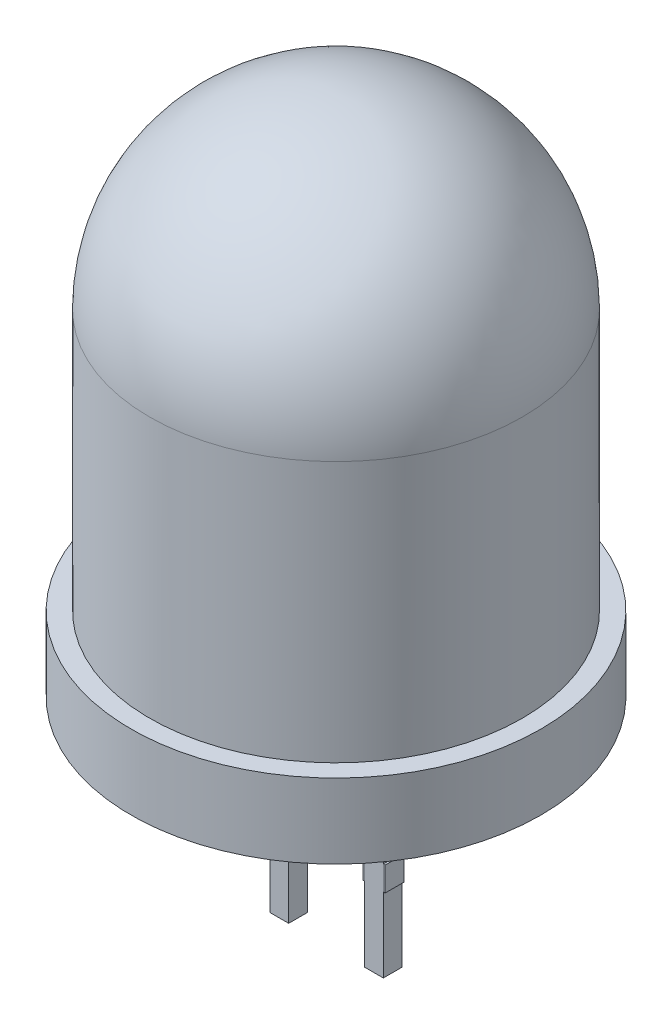
ISO-10303-21;
HEADER;
FILE_DESCRIPTION(('STEP AP214'),'2;1');
FILE_NAME('part.step','',(''),(''),'','','');
FILE_SCHEMA(('AUTOMOTIVE_DESIGN { 1 0 10303 214 1 1 1 1 }'));
ENDSEC;
DATA;
#1=APPLICATION_CONTEXT('core data for automotive mechanical design processes');
#2=APPLICATION_PROTOCOL_DEFINITION('international standard','automotive_design',2000,#1);
#3=PRODUCT_CONTEXT('',#1,'mechanical');
#4=PRODUCT('Part','Part','',(#3));
#5=PRODUCT_RELATED_PRODUCT_CATEGORY('part','',(#4));
#6=PRODUCT_DEFINITION_FORMATION('','',#4);
#7=PRODUCT_DEFINITION_CONTEXT('part definition',#1,'design');
#8=PRODUCT_DEFINITION('design','',#6,#7);
#9=PRODUCT_DEFINITION_SHAPE('','',#8);
#10=(LENGTH_UNIT() NAMED_UNIT(*) SI_UNIT(.MILLI.,.METRE.));
#11=(NAMED_UNIT(*) PLANE_ANGLE_UNIT() SI_UNIT($,.RADIAN.));
#12=(NAMED_UNIT(*) SI_UNIT($,.STERADIAN.) SOLID_ANGLE_UNIT());
#13=UNCERTAINTY_MEASURE_WITH_UNIT(LENGTH_MEASURE(1.E-05),#10,'distance_accuracy_value','');
#14=(GEOMETRIC_REPRESENTATION_CONTEXT(3) GLOBAL_UNCERTAINTY_ASSIGNED_CONTEXT((#13)) GLOBAL_UNIT_ASSIGNED_CONTEXT((#10,
#11,#12)) REPRESENTATION_CONTEXT('',''));
#15=CARTESIAN_POINT('',(0.,0.,0.));
#16=DIRECTION('',(0.,0.,1.));
#17=DIRECTION('',(1.,0.,0.));
#18=AXIS2_PLACEMENT_3D('',#15,#16,#17);
#19=CARTESIAN_POINT('',(0.,3.65,0.));
#20=DIRECTION('',(0.,1.,0.));
#21=DIRECTION('',(1.,0.,0.));
#22=AXIS2_PLACEMENT_3D('',#19,#20,#21);
#23=PLANE('',#22);
#24=CARTESIAN_POINT('',(0.,3.65,0.));
#25=DIRECTION('',(0.,1.,0.));
#26=DIRECTION('',(1.,0.,0.));
#27=AXIS2_PLACEMENT_3D('',#24,#25,#26);
#28=CIRCLE('',#27,5.5);
#29=CARTESIAN_POINT('',(-5.5,3.65,0.));
#30=VERTEX_POINT('',#29);
#31=EDGE_CURVE('P0_E11',#30,#30,#28,.T.);
#32=ORIENTED_EDGE('',*,*,#31,.F.);
#33=EDGE_LOOP('',(#32));
#34=FACE_BOUND('',#33,.T.);
#35=ADVANCED_FACE('P0_F17',(#34),#23,.F.);
#36=CARTESIAN_POINT('',(0.,5.65,0.));
#37=DIRECTION('',(0.,1.,0.));
#38=DIRECTION('',(1.,0.,0.));
#39=AXIS2_PLACEMENT_3D('',#36,#37,#38);
#40=PLANE('',#39);
#41=CARTESIAN_POINT('',(0.,5.65,0.));
#42=DIRECTION('',(0.,-1.,0.));
#43=DIRECTION('',(-1.,0.,0.));
#44=AXIS2_PLACEMENT_3D('',#41,#42,#43);
#45=CIRCLE('',#44,5.);
#46=CARTESIAN_POINT('',(5.,5.65,0.));
#47=VERTEX_POINT('',#46);
#48=EDGE_CURVE('P0_E55',#47,#47,#45,.T.);
#49=ORIENTED_EDGE('',*,*,#48,.T.);
#50=EDGE_LOOP('',(#49));
#51=FACE_BOUND('',#50,.T.);
#52=CARTESIAN_POINT('',(0.,5.65,0.));
#53=DIRECTION('',(0.,1.,0.));
#54=DIRECTION('',(1.,0.,0.));
#55=AXIS2_PLACEMENT_3D('',#52,#53,#54);
#56=CIRCLE('',#55,5.5);
#57=CARTESIAN_POINT('',(-5.5,5.65,0.));
#58=VERTEX_POINT('',#57);
#59=EDGE_CURVE('P0_E62',#58,#58,#56,.T.);
#60=ORIENTED_EDGE('',*,*,#59,.T.);
#61=EDGE_LOOP('',(#60));
#62=FACE_BOUND('',#61,.T.);
#63=ADVANCED_FACE('P0_F56',(#51,#62),#40,.T.);
#64=CARTESIAN_POINT('',(0.,3.65,0.));
#65=DIRECTION('',(0.,1.,0.));
#66=DIRECTION('',(1.,0.,0.));
#67=AXIS2_PLACEMENT_3D('',#64,#65,#66);
#68=CYLINDRICAL_SURFACE('',#67,5.5);
#69=ORIENTED_EDGE('',*,*,#59,.F.);
#70=DIRECTION('',(0.,-1.,0.));
#71=VECTOR('',#70,1.);
#72=CARTESIAN_POINT('',(-5.5,3.65,0.));
#73=LINE('',#72,#71);
#74=EDGE_CURVE('P0_E27',#58,#30,#73,.T.);
#75=ORIENTED_EDGE('',*,*,#74,.T.);
#76=ORIENTED_EDGE('',*,*,#31,.T.);
#77=ORIENTED_EDGE('',*,*,#74,.F.);
#78=EDGE_LOOP('',(#69,#75,#76,#77));
#79=FACE_BOUND('',#78,.T.);
#80=ADVANCED_FACE('P0_F131',(#79),#68,.T.);
#81=CARTESIAN_POINT('',(0.,5.65,0.));
#82=DIRECTION('',(0.,1.,0.));
#83=DIRECTION('',(-1.,0.,0.));
#84=AXIS2_PLACEMENT_3D('',#81,#82,#83);
#85=CYLINDRICAL_SURFACE('',#84,5.);
#86=CARTESIAN_POINT('',(0.,12.65,0.));
#87=DIRECTION('',(0.,1.,0.));
#88=DIRECTION('',(-1.,0.,0.));
#89=AXIS2_PLACEMENT_3D('',#86,#87,#88);
#90=CIRCLE('',#89,5.);
#91=CARTESIAN_POINT('',(5.,12.65,0.));
#92=VERTEX_POINT('',#91);
#93=CARTESIAN_POINT('',(0.,12.65,5.));
#94=VERTEX_POINT('',#93);
#95=EDGE_CURVE('P0_E80',#92,#94,#90,.T.);
#96=ORIENTED_EDGE('',*,*,#95,.F.);
#97=DIRECTION('',(0.,-1.,0.));
#98=VECTOR('',#97,1.);
#99=CARTESIAN_POINT('',(5.,5.65,0.));
#100=LINE('',#99,#98);
#101=EDGE_CURVE('P0_E20',#92,#47,#100,.T.);
#102=ORIENTED_EDGE('',*,*,#101,.T.);
#103=ORIENTED_EDGE('',*,*,#48,.F.);
#104=ORIENTED_EDGE('',*,*,#101,.F.);
#105=CARTESIAN_POINT('',(0.,12.65,0.));
#106=DIRECTION('',(0.,1.,0.));
#107=DIRECTION('',(-1.,0.,0.));
#108=AXIS2_PLACEMENT_3D('',#105,#106,#107);
#109=CIRCLE('',#108,5.);
#110=EDGE_CURVE('P0_E70',#94,#92,#109,.T.);
#111=ORIENTED_EDGE('',*,*,#110,.F.);
#112=EDGE_LOOP('',(#96,#102,#103,#104,#111));
#113=FACE_BOUND('',#112,.T.);
#114=ADVANCED_FACE('P0_F87',(#113),#85,.T.);
#115=CARTESIAN_POINT('',(0.,12.65,0.));
#116=DIRECTION('',(0.,1.,0.));
#117=DIRECTION('',(0.,0.,-1.));
#118=AXIS2_PLACEMENT_3D('',#115,#116,#117);
#119=SPHERICAL_SURFACE('',#118,5.);
#120=ORIENTED_EDGE('',*,*,#95,.T.);
#121=CARTESIAN_POINT('',(0.,12.65,0.));
#122=DIRECTION('',(1.,0.,0.));
#123=DIRECTION('',(0.,0.,1.));
#124=AXIS2_PLACEMENT_3D('',#121,#122,#123);
#125=CIRCLE('',#124,5.);
#126=CARTESIAN_POINT('',(0.,17.65,0.));
#127=VERTEX_POINT('',#126);
#128=EDGE_CURVE('P0_E76',#127,#94,#125,.T.);
#129=ORIENTED_EDGE('',*,*,#128,.F.);
#130=ORIENTED_EDGE('',*,*,#128,.T.);
#131=ORIENTED_EDGE('',*,*,#110,.T.);
#132=EDGE_LOOP('',(#120,#129,#130,#131));
#133=FACE_BOUND('',#132,.T.);
#134=ADVANCED_FACE('P0_F86',(#133),#119,.T.);
#135=CLOSED_SHELL('',(#35,#63,#80,#114,#134));
#136=MANIFOLD_SOLID_BREP('P0_B1',#135);
#137=CARTESIAN_POINT('',(-1.27,3.65,0.));
#138=DIRECTION('',(0.,-1.,0.));
#139=DIRECTION('',(0.,0.,-1.));
#140=AXIS2_PLACEMENT_3D('',#137,#138,#139);
#141=PLANE('',#140);
#142=DIRECTION('',(0.,0.,1.));
#143=VECTOR('',#142,1.);
#144=CARTESIAN_POINT('',(-1.52,3.65,-0.25));
#145=LINE('',#144,#143);
#146=CARTESIAN_POINT('',(-1.52,3.65,-0.25));
#147=VERTEX_POINT('',#146);
#148=CARTESIAN_POINT('',(-1.52,3.65,0.25));
#149=VERTEX_POINT('',#148);
#150=EDGE_CURVE('P1_E27',#147,#149,#145,.T.);
#151=ORIENTED_EDGE('',*,*,#150,.T.);
#152=DIRECTION('',(1.,0.,0.));
#153=VECTOR('',#152,1.);
#154=CARTESIAN_POINT('',(-1.52,3.65,0.25));
#155=LINE('',#154,#153);
#156=CARTESIAN_POINT('',(-1.02,3.65,0.25));
#157=VERTEX_POINT('',#156);
#158=EDGE_CURVE('P1_E88',#149,#157,#155,.T.);
#159=ORIENTED_EDGE('',*,*,#158,.T.);
#160=DIRECTION('',(0.,0.,-1.));
#161=VECTOR('',#160,1.);
#162=CARTESIAN_POINT('',(-1.02,3.65,0.25));
#163=LINE('',#162,#161);
#164=CARTESIAN_POINT('',(-1.02,3.65,-0.25));
#165=VERTEX_POINT('',#164);
#166=EDGE_CURVE('P1_E70',#157,#165,#163,.T.);
#167=ORIENTED_EDGE('',*,*,#166,.T.);
#168=DIRECTION('',(-1.,0.,0.));
#169=VECTOR('',#168,1.);
#170=CARTESIAN_POINT('',(-1.02,3.65,-0.25));
#171=LINE('',#170,#169);
#172=EDGE_CURVE('P1_E98',#165,#147,#171,.T.);
#173=ORIENTED_EDGE('',*,*,#172,.T.);
#174=EDGE_LOOP('',(#151,#159,#167,#173));
#175=FACE_BOUND('',#174,.T.);
#176=ADVANCED_FACE('P1_F17',(#175),#141,.F.);
#177=CARTESIAN_POINT('',(-1.27,-2.,0.));
#178=DIRECTION('',(0.,-1.,0.));
#179=DIRECTION('',(0.,0.,-1.));
#180=AXIS2_PLACEMENT_3D('',#177,#178,#179);
#181=PLANE('',#180);
#182=DIRECTION('',(0.,0.,-1.));
#183=VECTOR('',#182,1.);
#184=CARTESIAN_POINT('',(-1.52,-2.,-0.25));
#185=LINE('',#184,#183);
#186=CARTESIAN_POINT('',(-1.52,-2.,0.25));
#187=VERTEX_POINT('',#186);
#188=CARTESIAN_POINT('',(-1.52,-2.,-0.25));
#189=VERTEX_POINT('',#188);
#190=EDGE_CURVE('P1_E11',#187,#189,#185,.T.);
#191=ORIENTED_EDGE('',*,*,#190,.T.);
#192=DIRECTION('',(1.,0.,0.));
#193=VECTOR('',#192,1.);
#194=CARTESIAN_POINT('',(-1.02,-2.,-0.25));
#195=LINE('',#194,#193);
#196=CARTESIAN_POINT('',(-1.02,-2.,-0.25));
#197=VERTEX_POINT('',#196);
#198=EDGE_CURVE('P1_E100',#189,#197,#195,.T.);
#199=ORIENTED_EDGE('',*,*,#198,.T.);
#200=DIRECTION('',(0.,0.,1.));
#201=VECTOR('',#200,1.);
#202=CARTESIAN_POINT('',(-1.02,-2.,0.25));
#203=LINE('',#202,#201);
#204=CARTESIAN_POINT('',(-1.02,-2.,0.25));
#205=VERTEX_POINT('',#204);
#206=EDGE_CURVE('P1_E82',#197,#205,#203,.T.);
#207=ORIENTED_EDGE('',*,*,#206,.T.);
#208=DIRECTION('',(-1.,0.,0.));
#209=VECTOR('',#208,1.);
#210=CARTESIAN_POINT('',(-1.52,-2.,0.25));
#211=LINE('',#210,#209);
#212=EDGE_CURVE('P1_E89',#205,#187,#211,.T.);
#213=ORIENTED_EDGE('',*,*,#212,.T.);
#214=EDGE_LOOP('',(#191,#199,#207,#213));
#215=FACE_BOUND('',#214,.T.);
#216=ADVANCED_FACE('P1_F128',(#215),#181,.T.);
#217=CARTESIAN_POINT('',(-1.52,3.65,0.25));
#218=DIRECTION('',(-1.,0.,0.));
#219=DIRECTION('',(0.,0.,1.));
#220=AXIS2_PLACEMENT_3D('',#217,#218,#219);
#221=PLANE('',#220);
#222=ORIENTED_EDGE('',*,*,#150,.F.);
#223=DIRECTION('',(0.,-1.,0.));
#224=VECTOR('',#223,1.);
#225=CARTESIAN_POINT('',(-1.52,3.65,-0.25));
#226=LINE('',#225,#224);
#227=EDGE_CURVE('P1_E103',#147,#189,#226,.T.);
#228=ORIENTED_EDGE('',*,*,#227,.T.);
#229=ORIENTED_EDGE('',*,*,#190,.F.);
#230=DIRECTION('',(0.,-1.,0.));
#231=VECTOR('',#230,1.);
#232=CARTESIAN_POINT('',(-1.52,3.65,0.25));
#233=LINE('',#232,#231);
#234=EDGE_CURVE('P1_E20',#149,#187,#233,.T.);
#235=ORIENTED_EDGE('',*,*,#234,.F.);
#236=EDGE_LOOP('',(#222,#228,#229,#235));
#237=FACE_BOUND('',#236,.T.);
#238=ADVANCED_FACE('P1_F119',(#237),#221,.T.);
#239=CARTESIAN_POINT('',(-1.52,3.65,-0.25));
#240=DIRECTION('',(0.,0.,-1.));
#241=DIRECTION('',(0.,-1.,0.));
#242=AXIS2_PLACEMENT_3D('',#239,#240,#241);
#243=PLANE('',#242);
#244=ORIENTED_EDGE('',*,*,#172,.F.);
#245=DIRECTION('',(0.,-1.,0.));
#246=VECTOR('',#245,1.);
#247=CARTESIAN_POINT('',(-1.02,3.65,-0.25));
#248=LINE('',#247,#246);
#249=EDGE_CURVE('P1_E77',#165,#197,#248,.T.);
#250=ORIENTED_EDGE('',*,*,#249,.T.);
#251=ORIENTED_EDGE('',*,*,#198,.F.);
#252=ORIENTED_EDGE('',*,*,#227,.F.);
#253=EDGE_LOOP('',(#244,#250,#251,#252));
#254=FACE_BOUND('',#253,.T.);
#255=ADVANCED_FACE('P1_F114',(#254),#243,.T.);
#256=CARTESIAN_POINT('',(-1.02,3.65,-0.25));
#257=DIRECTION('',(1.,0.,0.));
#258=DIRECTION('',(0.,1.,0.));
#259=AXIS2_PLACEMENT_3D('',#256,#257,#258);
#260=PLANE('',#259);
#261=ORIENTED_EDGE('',*,*,#166,.F.);
#262=DIRECTION('',(0.,-1.,0.));
#263=VECTOR('',#262,1.);
#264=CARTESIAN_POINT('',(-1.02,3.65,0.25));
#265=LINE('',#264,#263);
#266=EDGE_CURVE('P1_E74',#157,#205,#265,.T.);
#267=ORIENTED_EDGE('',*,*,#266,.T.);
#268=ORIENTED_EDGE('',*,*,#206,.F.);
#269=ORIENTED_EDGE('',*,*,#249,.F.);
#270=EDGE_LOOP('',(#261,#267,#268,#269));
#271=FACE_BOUND('',#270,.T.);
#272=ADVANCED_FACE('P1_F72',(#271),#260,.T.);
#273=CARTESIAN_POINT('',(-1.02,3.65,0.25));
#274=DIRECTION('',(0.,0.,1.));
#275=DIRECTION('',(1.,0.,0.));
#276=AXIS2_PLACEMENT_3D('',#273,#274,#275);
#277=PLANE('',#276);
#278=ORIENTED_EDGE('',*,*,#158,.F.);
#279=ORIENTED_EDGE('',*,*,#234,.T.);
#280=ORIENTED_EDGE('',*,*,#212,.F.);
#281=ORIENTED_EDGE('',*,*,#266,.F.);
#282=EDGE_LOOP('',(#278,#279,#280,#281));
#283=FACE_BOUND('',#282,.T.);
#284=ADVANCED_FACE('P1_F86',(#283),#277,.T.);
#285=CLOSED_SHELL('',(#176,#216,#238,#255,#272,#284));
#286=MANIFOLD_SOLID_BREP('P1_B1',#285);
#287=CARTESIAN_POINT('',(1.27,3.65,0.));
#288=DIRECTION('',(0.,-1.,0.));
#289=DIRECTION('',(0.,0.,-1.));
#290=AXIS2_PLACEMENT_3D('',#287,#288,#289);
#291=PLANE('',#290);
#292=DIRECTION('',(1.,0.,0.));
#293=VECTOR('',#292,1.);
#294=CARTESIAN_POINT('',(1.02,3.65,0.25));
#295=LINE('',#294,#293);
#296=CARTESIAN_POINT('',(1.02,3.65,0.25));
#297=VERTEX_POINT('',#296);
#298=CARTESIAN_POINT('',(1.52,3.65,0.25));
#299=VERTEX_POINT('',#298);
#300=EDGE_CURVE('P2_E21',#297,#299,#295,.T.);
#301=ORIENTED_EDGE('',*,*,#300,.T.);
#302=DIRECTION('',(0.,0.,-1.));
#303=VECTOR('',#302,1.);
#304=CARTESIAN_POINT('',(1.52,3.65,0.25));
#305=LINE('',#304,#303);
#306=CARTESIAN_POINT('',(1.52,3.65,-0.25));
#307=VERTEX_POINT('',#306);
#308=EDGE_CURVE('P2_E92',#299,#307,#305,.T.);
#309=ORIENTED_EDGE('',*,*,#308,.T.);
#310=DIRECTION('',(-1.,0.,0.));
#311=VECTOR('',#310,1.);
#312=CARTESIAN_POINT('',(1.52,3.65,-0.25));
#313=LINE('',#312,#311);
#314=CARTESIAN_POINT('',(1.02,3.65,-0.25));
#315=VERTEX_POINT('',#314);
#316=EDGE_CURVE('P2_E86',#307,#315,#313,.T.);
#317=ORIENTED_EDGE('',*,*,#316,.T.);
#318=DIRECTION('',(0.,0.,1.));
#319=VECTOR('',#318,1.);
#320=CARTESIAN_POINT('',(1.02,3.65,-0.25));
#321=LINE('',#320,#319);
#322=EDGE_CURVE('P2_E71',#315,#297,#321,.T.);
#323=ORIENTED_EDGE('',*,*,#322,.T.);
#324=EDGE_LOOP('',(#301,#309,#317,#323));
#325=FACE_BOUND('',#324,.T.);
#326=ADVANCED_FACE('P2_F17',(#325),#291,.F.);
#327=CARTESIAN_POINT('',(1.27,-2.,0.));
#328=DIRECTION('',(0.,-1.,0.));
#329=DIRECTION('',(0.,0.,-1.));
#330=AXIS2_PLACEMENT_3D('',#327,#328,#329);
#331=PLANE('',#330);
#332=DIRECTION('',(-1.,0.,0.));
#333=VECTOR('',#332,1.);
#334=CARTESIAN_POINT('',(1.02,-2.,0.25));
#335=LINE('',#334,#333);
#336=CARTESIAN_POINT('',(1.52,-2.,0.25));
#337=VERTEX_POINT('',#336);
#338=CARTESIAN_POINT('',(1.02,-2.,0.25));
#339=VERTEX_POINT('',#338);
#340=EDGE_CURVE('P2_E11',#337,#339,#335,.T.);
#341=ORIENTED_EDGE('',*,*,#340,.T.);
#342=DIRECTION('',(0.,0.,-1.));
#343=VECTOR('',#342,1.);
#344=CARTESIAN_POINT('',(1.02,-2.,-0.25));
#345=LINE('',#344,#343);
#346=CARTESIAN_POINT('',(1.02,-2.,-0.25));
#347=VERTEX_POINT('',#346);
#348=EDGE_CURVE('P2_E81',#339,#347,#345,.T.);
#349=ORIENTED_EDGE('',*,*,#348,.T.);
#350=DIRECTION('',(1.,0.,0.));
#351=VECTOR('',#350,1.);
#352=CARTESIAN_POINT('',(1.52,-2.,-0.25));
#353=LINE('',#352,#351);
#354=CARTESIAN_POINT('',(1.52,-2.,-0.25));
#355=VERTEX_POINT('',#354);
#356=EDGE_CURVE('P2_E88',#347,#355,#353,.T.);
#357=ORIENTED_EDGE('',*,*,#356,.T.);
#358=DIRECTION('',(0.,0.,1.));
#359=VECTOR('',#358,1.);
#360=CARTESIAN_POINT('',(1.52,-2.,0.25));
#361=LINE('',#360,#359);
#362=EDGE_CURVE('P2_E102',#355,#337,#361,.T.);
#363=ORIENTED_EDGE('',*,*,#362,.T.);
#364=EDGE_LOOP('',(#341,#349,#357,#363));
#365=FACE_BOUND('',#364,.T.);
#366=ADVANCED_FACE('P2_F119',(#365),#331,.T.);
#367=CARTESIAN_POINT('',(1.52,3.65,0.25));
#368=DIRECTION('',(0.,0.,1.));
#369=DIRECTION('',(1.,0.,0.));
#370=AXIS2_PLACEMENT_3D('',#367,#368,#369);
#371=PLANE('',#370);
#372=ORIENTED_EDGE('',*,*,#300,.F.);
#373=DIRECTION('',(0.,-1.,0.));
#374=VECTOR('',#373,1.);
#375=CARTESIAN_POINT('',(1.02,3.65,0.25));
#376=LINE('',#375,#374);
#377=EDGE_CURVE('P2_E77',#297,#339,#376,.T.);
#378=ORIENTED_EDGE('',*,*,#377,.T.);
#379=ORIENTED_EDGE('',*,*,#340,.F.);
#380=DIRECTION('',(0.,-1.,0.));
#381=VECTOR('',#380,1.);
#382=CARTESIAN_POINT('',(1.52,3.65,0.25));
#383=LINE('',#382,#381);
#384=EDGE_CURVE('P2_E106',#299,#337,#383,.T.);
#385=ORIENTED_EDGE('',*,*,#384,.F.);
#386=EDGE_LOOP('',(#372,#378,#379,#385));
#387=FACE_BOUND('',#386,.T.);
#388=ADVANCED_FACE('P2_F118',(#387),#371,.T.);
#389=CARTESIAN_POINT('',(1.02,3.65,0.25));
#390=DIRECTION('',(-1.,0.,0.));
#391=DIRECTION('',(0.,0.,1.));
#392=AXIS2_PLACEMENT_3D('',#389,#390,#391);
#393=PLANE('',#392);
#394=ORIENTED_EDGE('',*,*,#322,.F.);
#395=DIRECTION('',(0.,-1.,0.));
#396=VECTOR('',#395,1.);
#397=CARTESIAN_POINT('',(1.02,3.65,-0.25));
#398=LINE('',#397,#396);
#399=EDGE_CURVE('P2_E75',#315,#347,#398,.T.);
#400=ORIENTED_EDGE('',*,*,#399,.T.);
#401=ORIENTED_EDGE('',*,*,#348,.F.);
#402=ORIENTED_EDGE('',*,*,#377,.F.);
#403=EDGE_LOOP('',(#394,#400,#401,#402));
#404=FACE_BOUND('',#403,.T.);
#405=ADVANCED_FACE('P2_F73',(#404),#393,.T.);
#406=CARTESIAN_POINT('',(1.02,3.65,-0.25));
#407=DIRECTION('',(0.,0.,-1.));
#408=DIRECTION('',(0.,-1.,0.));
#409=AXIS2_PLACEMENT_3D('',#406,#407,#408);
#410=PLANE('',#409);
#411=ORIENTED_EDGE('',*,*,#316,.F.);
#412=DIRECTION('',(0.,-1.,0.));
#413=VECTOR('',#412,1.);
#414=CARTESIAN_POINT('',(1.52,3.65,-0.25));
#415=LINE('',#414,#413);
#416=EDGE_CURVE('P2_E94',#307,#355,#415,.T.);
#417=ORIENTED_EDGE('',*,*,#416,.T.);
#418=ORIENTED_EDGE('',*,*,#356,.F.);
#419=ORIENTED_EDGE('',*,*,#399,.F.);
#420=EDGE_LOOP('',(#411,#417,#418,#419));
#421=FACE_BOUND('',#420,.T.);
#422=ADVANCED_FACE('P2_F84',(#421),#410,.T.);
#423=CARTESIAN_POINT('',(1.52,3.65,-0.25));
#424=DIRECTION('',(1.,0.,0.));
#425=DIRECTION('',(0.,1.,0.));
#426=AXIS2_PLACEMENT_3D('',#423,#424,#425);
#427=PLANE('',#426);
#428=ORIENTED_EDGE('',*,*,#308,.F.);
#429=ORIENTED_EDGE('',*,*,#384,.T.);
#430=ORIENTED_EDGE('',*,*,#362,.F.);
#431=ORIENTED_EDGE('',*,*,#416,.F.);
#432=EDGE_LOOP('',(#428,#429,#430,#431));
#433=FACE_BOUND('',#432,.T.);
#434=ADVANCED_FACE('P2_F19',(#433),#427,.T.);
#435=CLOSED_SHELL('',(#326,#366,#388,#405,#422,#434));
#436=MANIFOLD_SOLID_BREP('P2_B1',#435);
#437=CARTESIAN_POINT('',(-1.27,0.65,0.));
#438=DIRECTION('',(0.,-1.,0.));
#439=DIRECTION('',(0.,0.,-1.));
#440=AXIS2_PLACEMENT_3D('',#437,#438,#439);
#441=PLANE('',#440);
#442=DIRECTION('',(1.,0.,0.));
#443=VECTOR('',#442,1.);
#444=CARTESIAN_POINT('',(-1.57,0.65,0.25));
#445=LINE('',#444,#443);
#446=CARTESIAN_POINT('',(-1.57,0.65,0.25));
#447=VERTEX_POINT('',#446);
#448=CARTESIAN_POINT('',(-0.97,0.65,0.25));
#449=VERTEX_POINT('',#448);
#450=EDGE_CURVE('P3_E27',#447,#449,#445,.T.);
#451=ORIENTED_EDGE('',*,*,#450,.T.);
#452=DIRECTION('',(0.,0.,-1.));
#453=VECTOR('',#452,1.);
#454=CARTESIAN_POINT('',(-0.97,0.65,0.25));
#455=LINE('',#454,#453);
#456=CARTESIAN_POINT('',(-0.97,0.65,-0.25));
#457=VERTEX_POINT('',#456);
#458=EDGE_CURVE('P3_E73',#449,#457,#455,.T.);
#459=ORIENTED_EDGE('',*,*,#458,.T.);
#460=DIRECTION('',(-1.,0.,0.));
#461=VECTOR('',#460,1.);
#462=CARTESIAN_POINT('',(-0.97,0.65,-0.25));
#463=LINE('',#462,#461);
#464=CARTESIAN_POINT('',(-1.57,0.65,-0.25));
#465=VERTEX_POINT('',#464);
#466=EDGE_CURVE('P3_E96',#457,#465,#463,.T.);
#467=ORIENTED_EDGE('',*,*,#466,.T.);
#468=DIRECTION('',(0.,0.,1.));
#469=VECTOR('',#468,1.);
#470=CARTESIAN_POINT('',(-1.57,0.65,-0.25));
#471=LINE('',#470,#469);
#472=EDGE_CURVE('P3_E74',#465,#447,#471,.T.);
#473=ORIENTED_EDGE('',*,*,#472,.T.);
#474=EDGE_LOOP('',(#451,#459,#467,#473));
#475=FACE_BOUND('',#474,.T.);
#476=ADVANCED_FACE('P3_F17',(#475),#441,.F.);
#477=CARTESIAN_POINT('',(-1.27,0.,0.));
#478=DIRECTION('',(0.,-1.,0.));
#479=DIRECTION('',(0.,0.,-1.));
#480=AXIS2_PLACEMENT_3D('',#477,#478,#479);
#481=PLANE('',#480);
#482=DIRECTION('',(-1.,0.,0.));
#483=VECTOR('',#482,1.);
#484=CARTESIAN_POINT('',(-1.57,0.,0.25));
#485=LINE('',#484,#483);
#486=CARTESIAN_POINT('',(-0.97,0.,0.25));
#487=VERTEX_POINT('',#486);
#488=CARTESIAN_POINT('',(-1.57,0.,0.25));
#489=VERTEX_POINT('',#488);
#490=EDGE_CURVE('P3_E11',#487,#489,#485,.T.);
#491=ORIENTED_EDGE('',*,*,#490,.T.);
#492=DIRECTION('',(0.,0.,-1.));
#493=VECTOR('',#492,1.);
#494=CARTESIAN_POINT('',(-1.57,0.,-0.25));
#495=LINE('',#494,#493);
#496=CARTESIAN_POINT('',(-1.57,0.,-0.25));
#497=VERTEX_POINT('',#496);
#498=EDGE_CURVE('P3_E100',#489,#497,#495,.T.);
#499=ORIENTED_EDGE('',*,*,#498,.T.);
#500=DIRECTION('',(1.,0.,0.));
#501=VECTOR('',#500,1.);
#502=CARTESIAN_POINT('',(-0.97,0.,-0.25));
#503=LINE('',#502,#501);
#504=CARTESIAN_POINT('',(-0.97,0.,-0.25));
#505=VERTEX_POINT('',#504);
#506=EDGE_CURVE('P3_E21',#497,#505,#503,.T.);
#507=ORIENTED_EDGE('',*,*,#506,.T.);
#508=DIRECTION('',(0.,0.,1.));
#509=VECTOR('',#508,1.);
#510=CARTESIAN_POINT('',(-0.97,0.,0.25));
#511=LINE('',#510,#509);
#512=EDGE_CURVE('P3_E84',#505,#487,#511,.T.);
#513=ORIENTED_EDGE('',*,*,#512,.T.);
#514=EDGE_LOOP('',(#491,#499,#507,#513));
#515=FACE_BOUND('',#514,.T.);
#516=ADVANCED_FACE('P3_F118',(#515),#481,.T.);
#517=CARTESIAN_POINT('',(-0.97,0.65,0.25));
#518=DIRECTION('',(0.,0.,1.));
#519=DIRECTION('',(1.,0.,0.));
#520=AXIS2_PLACEMENT_3D('',#517,#518,#519);
#521=PLANE('',#520);
#522=ORIENTED_EDGE('',*,*,#450,.F.);
#523=DIRECTION('',(0.,-1.,0.));
#524=VECTOR('',#523,1.);
#525=CARTESIAN_POINT('',(-1.57,0.65,0.25));
#526=LINE('',#525,#524);
#527=EDGE_CURVE('P3_E76',#447,#489,#526,.T.);
#528=ORIENTED_EDGE('',*,*,#527,.T.);
#529=ORIENTED_EDGE('',*,*,#490,.F.);
#530=DIRECTION('',(0.,-1.,0.));
#531=VECTOR('',#530,1.);
#532=CARTESIAN_POINT('',(-0.97,0.65,0.25));
#533=LINE('',#532,#531);
#534=EDGE_CURVE('P3_E79',#449,#487,#533,.T.);
#535=ORIENTED_EDGE('',*,*,#534,.F.);
#536=EDGE_LOOP('',(#522,#528,#529,#535));
#537=FACE_BOUND('',#536,.T.);
#538=ADVANCED_FACE('P3_F80',(#537),#521,.T.);
#539=CARTESIAN_POINT('',(-1.57,0.65,0.25));
#540=DIRECTION('',(-1.,0.,0.));
#541=DIRECTION('',(0.,0.,1.));
#542=AXIS2_PLACEMENT_3D('',#539,#540,#541);
#543=PLANE('',#542);
#544=ORIENTED_EDGE('',*,*,#472,.F.);
#545=DIRECTION('',(0.,-1.,0.));
#546=VECTOR('',#545,1.);
#547=CARTESIAN_POINT('',(-1.57,0.65,-0.25));
#548=LINE('',#547,#546);
#549=EDGE_CURVE('P3_E94',#465,#497,#548,.T.);
#550=ORIENTED_EDGE('',*,*,#549,.T.);
#551=ORIENTED_EDGE('',*,*,#498,.F.);
#552=ORIENTED_EDGE('',*,*,#527,.F.);
#553=EDGE_LOOP('',(#544,#550,#551,#552));
#554=FACE_BOUND('',#553,.T.);
#555=ADVANCED_FACE('P3_F144',(#554),#543,.T.);
#556=CARTESIAN_POINT('',(-1.57,0.65,-0.25));
#557=DIRECTION('',(0.,0.,-1.));
#558=DIRECTION('',(0.,-1.,0.));
#559=AXIS2_PLACEMENT_3D('',#556,#557,#558);
#560=PLANE('',#559);
#561=ORIENTED_EDGE('',*,*,#466,.F.);
#562=DIRECTION('',(0.,-1.,0.));
#563=VECTOR('',#562,1.);
#564=CARTESIAN_POINT('',(-0.97,0.65,-0.25));
#565=LINE('',#564,#563);
#566=EDGE_CURVE('P3_E88',#457,#505,#565,.T.);
#567=ORIENTED_EDGE('',*,*,#566,.T.);
#568=ORIENTED_EDGE('',*,*,#506,.F.);
#569=ORIENTED_EDGE('',*,*,#549,.F.);
#570=EDGE_LOOP('',(#561,#567,#568,#569));
#571=FACE_BOUND('',#570,.T.);
#572=ADVANCED_FACE('P3_F116',(#571),#560,.T.);
#573=CARTESIAN_POINT('',(-0.97,0.65,-0.25));
#574=DIRECTION('',(1.,0.,0.));
#575=DIRECTION('',(0.,1.,0.));
#576=AXIS2_PLACEMENT_3D('',#573,#574,#575);
#577=PLANE('',#576);
#578=ORIENTED_EDGE('',*,*,#458,.F.);
#579=ORIENTED_EDGE('',*,*,#534,.T.);
#580=ORIENTED_EDGE('',*,*,#512,.F.);
#581=ORIENTED_EDGE('',*,*,#566,.F.);
#582=EDGE_LOOP('',(#578,#579,#580,#581));
#583=FACE_BOUND('',#582,.T.);
#584=ADVANCED_FACE('P3_F19',(#583),#577,.T.);
#585=CLOSED_SHELL('',(#476,#516,#538,#555,#572,#584));
#586=MANIFOLD_SOLID_BREP('P3_B1',#585);
#587=CARTESIAN_POINT('',(1.27,0.65,0.));
#588=DIRECTION('',(0.,-1.,0.));
#589=DIRECTION('',(0.,0.,-1.));
#590=AXIS2_PLACEMENT_3D('',#587,#588,#589);
#591=PLANE('',#590);
#592=DIRECTION('',(0.,0.,1.));
#593=VECTOR('',#592,1.);
#594=CARTESIAN_POINT('',(0.97,0.65,-0.25));
#595=LINE('',#594,#593);
#596=CARTESIAN_POINT('',(0.97,0.65,-0.25));
#597=VERTEX_POINT('',#596);
#598=CARTESIAN_POINT('',(0.97,0.65,0.25));
#599=VERTEX_POINT('',#598);
#600=EDGE_CURVE('P4_E27',#597,#599,#595,.T.);
#601=ORIENTED_EDGE('',*,*,#600,.T.);
#602=DIRECTION('',(1.,0.,0.));
#603=VECTOR('',#602,1.);
#604=CARTESIAN_POINT('',(0.97,0.65,0.25));
#605=LINE('',#604,#603);
#606=CARTESIAN_POINT('',(1.57,0.65,0.25));
#607=VERTEX_POINT('',#606);
#608=EDGE_CURVE('P4_E106',#599,#607,#605,.T.);
#609=ORIENTED_EDGE('',*,*,#608,.T.);
#610=DIRECTION('',(0.,0.,-1.));
#611=VECTOR('',#610,1.);
#612=CARTESIAN_POINT('',(1.57,0.65,0.25));
#613=LINE('',#612,#611);
#614=CARTESIAN_POINT('',(1.57,0.65,-0.25));
#615=VERTEX_POINT('',#614);
#616=EDGE_CURVE('P4_E60',#607,#615,#613,.T.);
#617=ORIENTED_EDGE('',*,*,#616,.T.);
#618=DIRECTION('',(-1.,0.,0.));
#619=VECTOR('',#618,1.);
#620=CARTESIAN_POINT('',(1.57,0.65,-0.25));
#621=LINE('',#620,#619);
#622=EDGE_CURVE('P4_E20',#615,#597,#621,.T.);
#623=ORIENTED_EDGE('',*,*,#622,.T.);
#624=EDGE_LOOP('',(#601,#609,#617,#623));
#625=FACE_BOUND('',#624,.T.);
#626=ADVANCED_FACE('P4_F16',(#625),#591,.F.);
#627=CARTESIAN_POINT('',(1.27,0.,0.));
#628=DIRECTION('',(0.,-1.,0.));
#629=DIRECTION('',(0.,0.,-1.));
#630=AXIS2_PLACEMENT_3D('',#627,#628,#629);
#631=PLANE('',#630);
#632=DIRECTION('',(0.,0.,-1.));
#633=VECTOR('',#632,1.);
#634=CARTESIAN_POINT('',(0.97,0.,-0.25));
#635=LINE('',#634,#633);
#636=CARTESIAN_POINT('',(0.97,0.,0.25));
#637=VERTEX_POINT('',#636);
#638=CARTESIAN_POINT('',(0.97,0.,-0.25));
#639=VERTEX_POINT('',#638);
#640=EDGE_CURVE('P4_E10',#637,#639,#635,.T.);
#641=ORIENTED_EDGE('',*,*,#640,.T.);
#642=DIRECTION('',(1.,0.,0.));
#643=VECTOR('',#642,1.);
#644=CARTESIAN_POINT('',(1.57,0.,-0.25));
#645=LINE('',#644,#643);
#646=CARTESIAN_POINT('',(1.57,0.,-0.25));
#647=VERTEX_POINT('',#646);
#648=EDGE_CURVE('P4_E78',#639,#647,#645,.T.);
#649=ORIENTED_EDGE('',*,*,#648,.T.);
#650=DIRECTION('',(0.,0.,1.));
#651=VECTOR('',#650,1.);
#652=CARTESIAN_POINT('',(1.57,0.,0.25));
#653=LINE('',#652,#651);
#654=CARTESIAN_POINT('',(1.57,0.,0.25));
#655=VERTEX_POINT('',#654);
#656=EDGE_CURVE('P4_E82',#647,#655,#653,.T.);
#657=ORIENTED_EDGE('',*,*,#656,.T.);
#658=DIRECTION('',(-1.,0.,0.));
#659=VECTOR('',#658,1.);
#660=CARTESIAN_POINT('',(0.97,0.,0.25));
#661=LINE('',#660,#659);
#662=EDGE_CURVE('P4_E101',#655,#637,#661,.T.);
#663=ORIENTED_EDGE('',*,*,#662,.T.);
#664=EDGE_LOOP('',(#641,#649,#657,#663));
#665=FACE_BOUND('',#664,.T.);
#666=ADVANCED_FACE('P4_F80',(#665),#631,.T.);
#667=CARTESIAN_POINT('',(0.97,0.65,0.25));
#668=DIRECTION('',(-1.,0.,0.));
#669=DIRECTION('',(0.,0.,1.));
#670=AXIS2_PLACEMENT_3D('',#667,#668,#669);
#671=PLANE('',#670);
#672=ORIENTED_EDGE('',*,*,#600,.F.);
#673=DIRECTION('',(0.,-1.,0.));
#674=VECTOR('',#673,1.);
#675=CARTESIAN_POINT('',(0.97,0.65,-0.25));
#676=LINE('',#675,#674);
#677=EDGE_CURVE('P4_E86',#597,#639,#676,.T.);
#678=ORIENTED_EDGE('',*,*,#677,.T.);
#679=ORIENTED_EDGE('',*,*,#640,.F.);
#680=DIRECTION('',(0.,-1.,0.));
#681=VECTOR('',#680,1.);
#682=CARTESIAN_POINT('',(0.97,0.65,0.25));
#683=LINE('',#682,#681);
#684=EDGE_CURVE('P4_E102',#599,#637,#683,.T.);
#685=ORIENTED_EDGE('',*,*,#684,.F.);
#686=EDGE_LOOP('',(#672,#678,#679,#685));
#687=FACE_BOUND('',#686,.T.);
#688=ADVANCED_FACE('P4_F116',(#687),#671,.T.);
#689=CARTESIAN_POINT('',(0.97,0.65,-0.25));
#690=DIRECTION('',(0.,0.,-1.));
#691=DIRECTION('',(0.,-1.,0.));
#692=AXIS2_PLACEMENT_3D('',#689,#690,#691);
#693=PLANE('',#692);
#694=ORIENTED_EDGE('',*,*,#622,.F.);
#695=DIRECTION('',(0.,-1.,0.));
#696=VECTOR('',#695,1.);
#697=CARTESIAN_POINT('',(1.57,0.65,-0.25));
#698=LINE('',#697,#696);
#699=EDGE_CURVE('P4_E88',#615,#647,#698,.T.);
#700=ORIENTED_EDGE('',*,*,#699,.T.);
#701=ORIENTED_EDGE('',*,*,#648,.F.);
#702=ORIENTED_EDGE('',*,*,#677,.F.);
#703=EDGE_LOOP('',(#694,#700,#701,#702));
#704=FACE_BOUND('',#703,.T.);
#705=ADVANCED_FACE('P4_F89',(#704),#693,.T.);
#706=CARTESIAN_POINT('',(1.57,0.65,-0.25));
#707=DIRECTION('',(1.,0.,0.));
#708=DIRECTION('',(0.,1.,0.));
#709=AXIS2_PLACEMENT_3D('',#706,#707,#708);
#710=PLANE('',#709);
#711=ORIENTED_EDGE('',*,*,#616,.F.);
#712=DIRECTION('',(0.,-1.,0.));
#713=VECTOR('',#712,1.);
#714=CARTESIAN_POINT('',(1.57,0.65,0.25));
#715=LINE('',#714,#713);
#716=EDGE_CURVE('P4_E92',#607,#655,#715,.T.);
#717=ORIENTED_EDGE('',*,*,#716,.T.);
#718=ORIENTED_EDGE('',*,*,#656,.F.);
#719=ORIENTED_EDGE('',*,*,#699,.F.);
#720=EDGE_LOOP('',(#711,#717,#718,#719));
#721=FACE_BOUND('',#720,.T.);
#722=ADVANCED_FACE('P4_F18',(#721),#710,.T.);
#723=CARTESIAN_POINT('',(1.57,0.65,0.25));
#724=DIRECTION('',(0.,0.,1.));
#725=DIRECTION('',(1.,0.,0.));
#726=AXIS2_PLACEMENT_3D('',#723,#724,#725);
#727=PLANE('',#726);
#728=ORIENTED_EDGE('',*,*,#608,.F.);
#729=ORIENTED_EDGE('',*,*,#684,.T.);
#730=ORIENTED_EDGE('',*,*,#662,.F.);
#731=ORIENTED_EDGE('',*,*,#716,.F.);
#732=EDGE_LOOP('',(#728,#729,#730,#731));
#733=FACE_BOUND('',#732,.T.);
#734=ADVANCED_FACE('P4_F123',(#733),#727,.T.);
#735=CLOSED_SHELL('',(#626,#666,#688,#705,#722,#734));
#736=MANIFOLD_SOLID_BREP('P4_B1',#735);
#737=ADVANCED_BREP_SHAPE_REPRESENTATION('',(#18,#136,#286,#436,#586,#736),#14);
#738=SHAPE_DEFINITION_REPRESENTATION(#9,#737);
ENDSEC;
END-ISO-10303-21;
